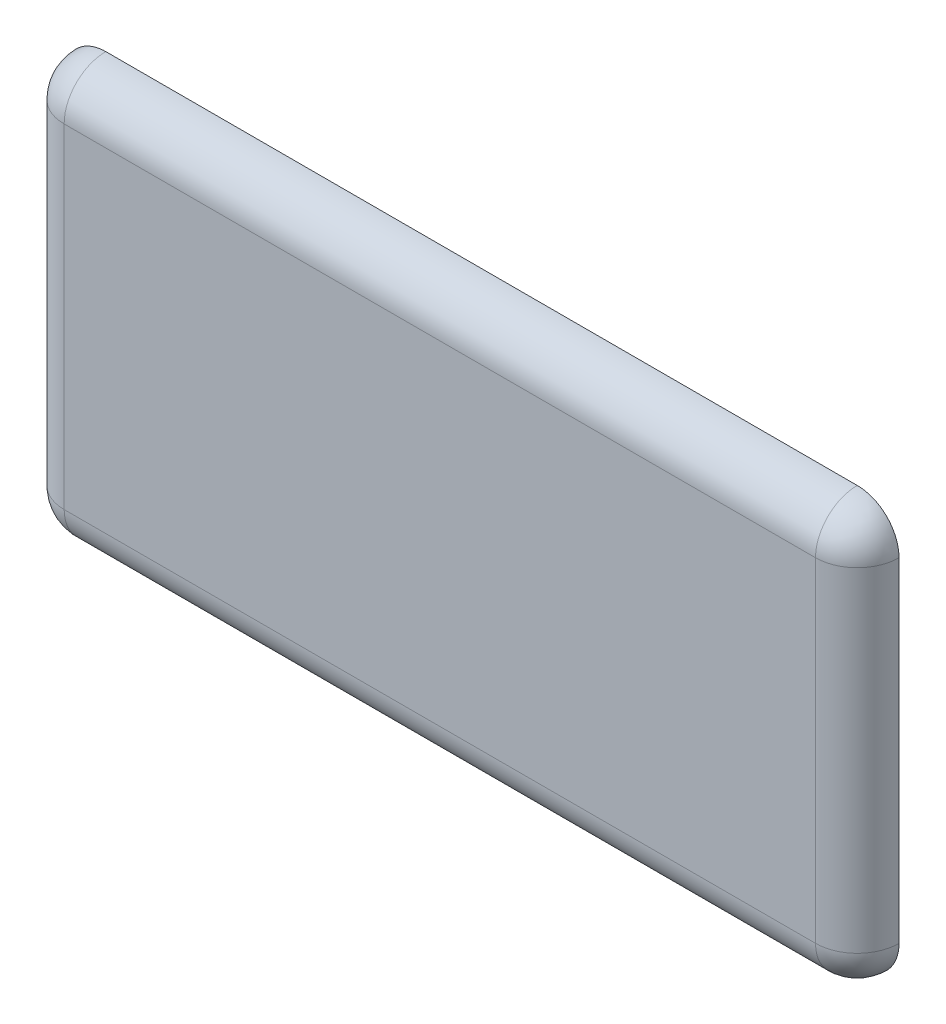
ISO-10303-21;
HEADER;
FILE_DESCRIPTION(('STEP AP214'),'2;1');
FILE_NAME('part.step','',(''),(''),'','','');
FILE_SCHEMA(('AUTOMOTIVE_DESIGN { 1 0 10303 214 1 1 1 1 }'));
ENDSEC;
DATA;
#1=APPLICATION_CONTEXT('core data for automotive mechanical design processes');
#2=APPLICATION_PROTOCOL_DEFINITION('international standard','automotive_design',2000,#1);
#3=PRODUCT_CONTEXT('',#1,'mechanical');
#4=PRODUCT('Part','Part','',(#3));
#5=PRODUCT_RELATED_PRODUCT_CATEGORY('part','',(#4));
#6=PRODUCT_DEFINITION_FORMATION('','',#4);
#7=PRODUCT_DEFINITION_CONTEXT('part definition',#1,'design');
#8=PRODUCT_DEFINITION('design','',#6,#7);
#9=PRODUCT_DEFINITION_SHAPE('','',#8);
#10=(LENGTH_UNIT() NAMED_UNIT(*) SI_UNIT(.MILLI.,.METRE.));
#11=(NAMED_UNIT(*) PLANE_ANGLE_UNIT() SI_UNIT($,.RADIAN.));
#12=(NAMED_UNIT(*) SI_UNIT($,.STERADIAN.) SOLID_ANGLE_UNIT());
#13=UNCERTAINTY_MEASURE_WITH_UNIT(LENGTH_MEASURE(1.E-05),#10,'distance_accuracy_value','');
#14=(GEOMETRIC_REPRESENTATION_CONTEXT(3) GLOBAL_UNCERTAINTY_ASSIGNED_CONTEXT((#13)) GLOBAL_UNIT_ASSIGNED_CONTEXT((#10,
#11,#12)) REPRESENTATION_CONTEXT('',''));
#15=CARTESIAN_POINT('',(0.,0.,0.));
#16=DIRECTION('',(0.,0.,1.));
#17=DIRECTION('',(1.,0.,0.));
#18=AXIS2_PLACEMENT_3D('',#15,#16,#17);
#19=CARTESIAN_POINT('',(4.,4.,4.));
#20=DIRECTION('',(0.,0.,1.));
#21=DIRECTION('',(1.,0.,0.));
#22=AXIS2_PLACEMENT_3D('',#19,#20,#21);
#23=PLANE('',#22);
#24=DIRECTION('',(-1.,0.,0.));
#25=VECTOR('',#24,1.);
#26=CARTESIAN_POINT('',(76.,4.00000000000005,3.99999999999999));
#27=LINE('',#26,#25);
#28=CARTESIAN_POINT('',(75.9999999996317,4.00000000000002,3.99999999999944));
#29=VERTEX_POINT('',#28);
#30=CARTESIAN_POINT('',(3.99999999999997,4.00000000000002,4.00000000000005));
#31=VERTEX_POINT('',#30);
#32=EDGE_CURVE('E90',#29,#31,#27,.T.);
#33=ORIENTED_EDGE('',*,*,#32,.F.);
#34=DIRECTION('',(0.,-1.,0.));
#35=VECTOR('',#34,1.);
#36=CARTESIAN_POINT('',(76.,36.,3.9999999999989));
#37=LINE('',#36,#35);
#38=CARTESIAN_POINT('',(76.,35.9999946296296,3.9999999999997));
#39=VERTEX_POINT('',#38);
#40=EDGE_CURVE('E67',#39,#29,#37,.T.);
#41=ORIENTED_EDGE('',*,*,#40,.F.);
#42=DIRECTION('',(1.,0.,0.));
#43=VECTOR('',#42,1.);
#44=CARTESIAN_POINT('',(4.,35.9999983333333,4.));
#45=LINE('',#44,#43);
#46=CARTESIAN_POINT('',(3.99999698393829,35.9999939253962,3.99999999999943));
#47=VERTEX_POINT('',#46);
#48=EDGE_CURVE('E112',#47,#39,#45,.T.);
#49=ORIENTED_EDGE('',*,*,#48,.F.);
#50=DIRECTION('',(0.,-1.,0.));
#51=VECTOR('',#50,1.);
#52=CARTESIAN_POINT('',(4.,36.,4.00000000000012));
#53=LINE('',#52,#51);
#54=EDGE_CURVE('E91',#31,#47,#53,.F.);
#55=ORIENTED_EDGE('',*,*,#54,.F.);
#56=EDGE_LOOP('',(#33,#41,#49,#55));
#57=FACE_BOUND('',#56,.T.);
#58=ADVANCED_FACE('F16',(#57),#23,.T.);
#59=CARTESIAN_POINT('',(76.,36.,0.));
#60=DIRECTION('',(0.381049633011538,-0.924554583127342,0.));
#61=DIRECTION('',(0.,0.,-1.));
#62=AXIS2_PLACEMENT_3D('',#59,#60,#61);
#63=SPHERICAL_SURFACE('',#62,3.99999999999981);
#64=CARTESIAN_POINT('',(76.,39.9999999999998,0.));
#65=CARTESIAN_POINT('',(76.1125064846693,40.0000107801648,0.));
#66=CARTESIAN_POINT('',(76.2250078596815,39.9952533978363,0.));
#67=CARTESIAN_POINT('',(76.4492056808409,39.9762857323358,0.));
#68=CARTESIAN_POINT('',(76.5609021653406,39.9620759026152,0.));
#69=CARTESIAN_POINT('',(76.7826226412643,39.9243010286425,0.));
#70=CARTESIAN_POINT('',(76.8926478326796,39.900743061469,0.));
#71=CARTESIAN_POINT('',(77.1102957536248,39.8444630035519,0.));
#72=CARTESIAN_POINT('',(77.2179185124643,39.8117410246754,0.));
#73=CARTESIAN_POINT('',(77.5361447238502,39.7000934071667,0.));
#74=CARTESIAN_POINT('',(77.7421963398768,39.6076706332295,0.));
#75=CARTESIAN_POINT('',(78.1357069471823,39.3896049845834,0.));
#76=CARTESIAN_POINT('',(78.3231692057971,39.2639679620186,0.));
#77=CARTESIAN_POINT('',(78.6743715803179,38.9829981889779,0.));
#78=CARTESIAN_POINT('',(78.8381119277055,38.8276657283084,0.));
#79=CARTESIAN_POINT('',(79.1372150568841,38.4916826745306,0.));
#80=CARTESIAN_POINT('',(79.2725722809909,38.3110271344568,0.));
#81=CARTESIAN_POINT('',(79.5110563074748,37.9295368825367,0.));
#82=CARTESIAN_POINT('',(79.6141767999037,37.7286982302454,0.));
#83=CARTESIAN_POINT('',(79.7851821448691,37.3125987428058,0.));
#84=CARTESIAN_POINT('',(79.85308763485,37.0973464383637,0.));
#85=CARTESIAN_POINT('',(79.9348605214169,36.7339807389415,0.));
#86=CARTESIAN_POINT('',(79.9592730691926,36.5881531888869,0.));
#87=CARTESIAN_POINT('',(79.9918406722692,36.2949041344534,0.));
#88=CARTESIAN_POINT('',(80.0000187754479,36.1474851889585,0.));
#89=CARTESIAN_POINT('',(79.9999999999998,36.0000000000001,0.));
#90=B_SPLINE_CURVE_WITH_KNOTS('',3,(#64,#65,#66,#67,#68,#69,#70,#71,#72,#73,#74,#75,#76,#77,#78,
#79,#80,#81,#82,#83,#84,#85,#86,#87,#88,#89),.UNSPECIFIED.,.F.,.F.,(4,2,2,2,2,2,2,2,2,2,2,2,4),
(0.,0.337409690213672,0.674803195430451,1.01194176015814,1.34907620955056,2.02307394016258,
2.69695299561827,3.37082547482495,4.04482978167726,4.71896593418993,5.39270656736755,
5.83543557899228,6.27753560189477),.UNSPECIFIED.);
#91=CARTESIAN_POINT('',(76.,39.9999947435897,0.));
#92=VERTEX_POINT('',#91);
#93=CARTESIAN_POINT('',(79.9999999999998,36.,0.));
#94=VERTEX_POINT('',#93);
#95=EDGE_CURVE('E114',#92,#94,#90,.T.);
#96=ORIENTED_EDGE('',*,*,#95,.F.);
#97=CARTESIAN_POINT('',(76.,39.9999999999998,0.));
#98=CARTESIAN_POINT('',(75.9998688575037,40.0000019971717,0.0741499115106724));
#99=CARTESIAN_POINT('',(75.9996634653779,39.9979381764212,0.148297534387984));
#100=CARTESIAN_POINT('',(75.9993613868545,39.9897283979854,0.295754471272515));
#101=CARTESIAN_POINT('',(75.999263819873,39.9836161701213,0.369065662880881));
#102=CARTESIAN_POINT('',(75.9994259186952,39.967171062917,0.516927306231345));
#103=CARTESIAN_POINT('',(75.9996938654879,39.9567442001472,0.591467402450888));
#104=CARTESIAN_POINT('',(75.9999296973082,39.9377551802842,0.703986049897767));
#105=CARTESIAN_POINT('',(75.9999800093613,39.9307260849792,0.742229077633415));
#106=CARTESIAN_POINT('',(76.0000180127654,39.9163065782062,0.814720880165904));
#107=CARTESIAN_POINT('',(76.000011407297,39.9090207240107,0.848990480687181));
#108=CARTESIAN_POINT('',(76.0000189047354,39.8853680474026,0.953473393795146));
#109=CARTESIAN_POINT('',(76.000062303017,39.8675476206773,1.02336344051551));
#110=CARTESIAN_POINT('',(76.0001028626452,39.8272511846961,1.16526224007295));
#111=CARTESIAN_POINT('',(76.0000978075774,39.8045988657442,1.2372207646452));
#112=CARTESIAN_POINT('',(76.0000448147382,39.7540029992485,1.38338079503893));
#113=CARTESIAN_POINT('',(75.9999947026984,39.7258484896681,1.45750948079101));
#114=CARTESIAN_POINT('',(76.0000046392359,39.6689556082914,1.59486157767355));
#115=CARTESIAN_POINT('',(76.0000517762743,39.6407242551955,1.6582957416157));
#116=CARTESIAN_POINT('',(76.0001198970873,39.5791706206728,1.78744597647618));
#117=CARTESIAN_POINT('',(76.0001391032633,39.5456424892112,1.85306403055476));
#118=CARTESIAN_POINT('',(76.0001149896674,39.4729108847655,1.98619729913405));
#119=CARTESIAN_POINT('',(76.000067883723,39.433488481998,2.05359328330954));
#120=CARTESIAN_POINT('',(76.0000155164451,39.3705707533344,2.15427691549354));
#121=CARTESIAN_POINT('',(76.0000010182472,39.348482575026,2.1884514615617));
#122=CARTESIAN_POINT('',(75.999999144699,39.3068915739986,2.25069680360541));
#123=CARTESIAN_POINT('',(76.0000078002596,39.2875406688681,2.27886920496695));
#124=CARTESIAN_POINT('',(76.0000382400029,39.2265658435533,2.36524668660633));
#125=CARTESIAN_POINT('',(76.0000640297798,39.1837276153916,2.42260157085266));
#126=CARTESIAN_POINT('',(76.0000856046525,39.0923680353896,2.53830984032111));
#127=CARTESIAN_POINT('',(76.000079489659,39.0436598014988,2.59651541749076));
#128=CARTESIAN_POINT('',(76.0000253786652,38.9401373064271,2.71330480137671));
#129=CARTESIAN_POINT('',(75.9999750132988,38.8851332277695,2.77172075075565));
#130=CARTESIAN_POINT('',(76.0000194453907,38.7842967565098,2.87255770385692));
#131=CARTESIAN_POINT('',(76.0000845271071,38.7391355719894,2.91565289347235));
#132=CARTESIAN_POINT('',(76.000270753264,38.6438076798383,3.00244972417924));
#133=CARTESIAN_POINT('',(76.0003953050452,38.5935071442835,3.04600466246026));
#134=CARTESIAN_POINT('',(76.0006047991161,38.4876078713509,3.13317702504959));
#135=CARTESIAN_POINT('',(76.000686801067,38.431874099724,3.17663033815556));
#136=CARTESIAN_POINT('',(76.0007768580484,38.3148440276089,3.26298781242491));
#137=CARTESIAN_POINT('',(76.0007802932854,38.2534132076597,3.30571024450839));
#138=CARTESIAN_POINT('',(76.0007265322809,38.1582492513185,3.36800797658096));
#139=CARTESIAN_POINT('',(76.0006975988659,38.1253483103497,3.38886582846301));
#140=CARTESIAN_POINT('',(76.0006233074073,38.058066619047,3.43015454424354));
#141=CARTESIAN_POINT('',(76.0005775327432,38.0236697887704,3.45055927167883));
#142=CARTESIAN_POINT('',(76.0004753544321,37.9533814500471,3.49084284982618));
#143=CARTESIAN_POINT('',(76.0004187062305,37.9174743021363,3.51069439835718));
#144=CARTESIAN_POINT('',(76.0003040477201,37.8441537544346,3.54976981512328));
#145=CARTESIAN_POINT('',(76.0002460390644,37.8067252004519,3.56896525456613));
#146=CARTESIAN_POINT('',(76.000139387507,37.730355627816,3.60662253510487));
#147=CARTESIAN_POINT('',(76.0000910092735,37.6914000305115,3.62505482781924));
#148=CARTESIAN_POINT('',(76.0000229758318,37.6119771490597,3.66107585072054));
#149=CARTESIAN_POINT('',(76.0000040341763,37.5714959810948,3.67863392226024));
#150=CARTESIAN_POINT('',(75.9999938022788,37.4681105193974,3.72145740593015));
#151=CARTESIAN_POINT('',(76.0000227896367,37.404823887234,3.74580620838688));
#152=CARTESIAN_POINT('',(76.000059954284,37.2718119897775,3.79313615442436));
#153=CARTESIAN_POINT('',(76.0000662110757,37.201987282329,3.815837400216));
#154=CARTESIAN_POINT('',(76.0000560938495,37.0558049142171,3.85895286987174));
#155=CARTESIAN_POINT('',(76.0000379527386,36.9793559770724,3.87905947370731));
#156=CARTESIAN_POINT('',(76.0000045727445,36.8618500573143,3.9062701600055));
#157=CARTESIAN_POINT('',(75.9999920244167,36.8211684835732,3.91502405491543));
#158=CARTESIAN_POINT('',(76.0000050866501,36.754335035777,3.928318071978));
#159=CARTESIAN_POINT('',(76.0000185216174,36.728257804406,3.93323596210387));
#160=CARTESIAN_POINT('',(76.0000757919011,36.6391980356264,3.94911530927755));
#161=CARTESIAN_POINT('',(76.0001357891875,36.5759862436643,3.9588288245884));
#162=CARTESIAN_POINT('',(76.0001739798897,36.4754923657935,3.97181399352602));
#163=CARTESIAN_POINT('',(76.0001757876713,36.4383351014697,3.97608617070908));
#164=CARTESIAN_POINT('',(76.0001627156972,36.360308503568,3.98395034698343));
#165=CARTESIAN_POINT('',(76.0001462020771,36.3194283356242,3.98743633444423));
#166=CARTESIAN_POINT('',(76.0001012067765,36.2339667067364,3.99340115138218));
#167=CARTESIAN_POINT('',(76.0000717970993,36.1893771487984,3.99576387402017));
#168=CARTESIAN_POINT('',(76.0000210916473,36.0965277242967,3.99912646840141));
#169=CARTESIAN_POINT('',(76.0000006466102,36.0482632679732,4.00000037219625));
#170=CARTESIAN_POINT('',(76.,35.9999983333333,3.99999999999947));
#171=B_SPLINE_CURVE_WITH_KNOTS('',3,(#97,#98,#99,#100,#101,#102,#103,#104,#105,#106,#107,#108,
#109,#110,#111,#112,#113,#114,#115,#116,#117,#118,#119,#120,#121,#122,#123,#124,#125,#126,#127,
#128,#129,#130,#131,#132,#133,#134,#135,#136,#137,#138,#139,#140,#141,#142,#143,#144,#145,#146,
#147,#148,#149,#150,#151,#152,#153,#154,#155,#156,#157,#158,#159,#160,#161,#162,#163,#164,#165,
#166,#167,#168,#169,#170),.UNSPECIFIED.,.F.,.F.,(4,2,2,2,2,2,2,2,2,2,2,2,2,2,2,2,2,2,2,2,2,2,2,
2,2,2,2,2,2,2,2,2,2,2,2,2,4),(0.,0.222417107584018,0.443004044117348,0.668672421350455,
0.785308823638937,0.890405222374476,1.10666933983117,1.33287163712201,1.57061238118346,
1.77881939766156,1.99977174746332,2.23386354765696,2.35592082185084,2.45844574374509,
2.6730946516346,2.9006676552998,3.14122346247322,3.32843111360665,3.52795779182127,
3.73987604262706,3.96422516162846,4.08107766836807,4.20104000291186,4.32410892828857,
4.45027954744465,4.57954535156464,4.71189826888602,4.91523258461934,5.13539259159881,
5.37238755666628,5.49720720552452,5.57681440863209,5.76858748558689,5.88078197234026,
6.0038472341257,6.13777877391592,6.28256453799615),.UNSPECIFIED.);
#172=EDGE_CURVE('E109',#39,#92,#171,.F.);
#173=ORIENTED_EDGE('',*,*,#172,.F.);
#174=CARTESIAN_POINT('',(76.0000000000002,36.,-5.42751607546244E-13));
#175=DIRECTION('',(0.,-1.,0.));
#176=DIRECTION('',(0.,0.,-1.));
#177=AXIS2_PLACEMENT_3D('',#174,#175,#176);
#178=CIRCLE('',#177,3.99999999999944);
#179=EDGE_CURVE('E74',#94,#39,#178,.T.);
#180=ORIENTED_EDGE('',*,*,#179,.F.);
#181=EDGE_LOOP('',(#96,#173,#180));
#182=FACE_BOUND('',#181,.T.);
#183=ADVANCED_FACE('F125',(#182),#63,.T.);
#184=CARTESIAN_POINT('',(76.0000000000002,36.,-5.42751607546244E-13));
#185=DIRECTION('',(0.,-1.,0.));
#186=DIRECTION('',(0.,0.,-1.));
#187=AXIS2_PLACEMENT_3D('',#184,#185,#186);
#188=CYLINDRICAL_SURFACE('',#187,3.99999999999944);
#189=CARTESIAN_POINT('',(76.0000000000002,4.,-5.42751607546244E-13));
#190=DIRECTION('',(0.,-1.,0.));
#191=DIRECTION('',(0.,0.,-1.));
#192=AXIS2_PLACEMENT_3D('',#189,#190,#191);
#193=CIRCLE('',#192,3.99999999999944);
#194=CARTESIAN_POINT('',(79.9999999999998,4.,0.));
#195=VERTEX_POINT('',#194);
#196=EDGE_CURVE('E71',#195,#29,#193,.T.);
#197=ORIENTED_EDGE('',*,*,#196,.F.);
#198=DIRECTION('',(0.,1.,0.));
#199=VECTOR('',#198,1.);
#200=CARTESIAN_POINT('',(79.9999999999999,0.,0.));
#201=LINE('',#200,#199);
#202=EDGE_CURVE('E212',#94,#195,#201,.F.);
#203=ORIENTED_EDGE('',*,*,#202,.F.);
#204=ORIENTED_EDGE('',*,*,#179,.T.);
#205=ORIENTED_EDGE('',*,*,#40,.T.);
#206=EDGE_LOOP('',(#197,#203,#204,#205));
#207=FACE_BOUND('',#206,.T.);
#208=ADVANCED_FACE('F69',(#207),#188,.T.);
#209=CARTESIAN_POINT('',(76.,4.,0.));
#210=DIRECTION('',(-0.924554583722732,-0.381049631566919,0.));
#211=DIRECTION('',(0.,0.,-1.));
#212=AXIS2_PLACEMENT_3D('',#209,#210,#211);
#213=SPHERICAL_SURFACE('',#212,4.00000000000002);
#214=CARTESIAN_POINT('',(80.,4.,0.));
#215=CARTESIAN_POINT('',(80.000010780165,3.88749351533068,0.));
#216=CARTESIAN_POINT('',(79.9952533978365,3.77499214031856,0.));
#217=CARTESIAN_POINT('',(79.9762857323361,3.55079431915904,0.));
#218=CARTESIAN_POINT('',(79.9620759026154,3.43909783465938,0.));
#219=CARTESIAN_POINT('',(79.9243010286427,3.21737735873566,0.));
#220=CARTESIAN_POINT('',(79.9007430614691,3.10735216732032,0.));
#221=CARTESIAN_POINT('',(79.8444630035521,2.88970424637512,0.));
#222=CARTESIAN_POINT('',(79.8117410246755,2.78208148753563,0.));
#223=CARTESIAN_POINT('',(79.7000934071669,2.46385527614969,0.));
#224=CARTESIAN_POINT('',(79.6076706332297,2.2578036601231,0.));
#225=CARTESIAN_POINT('',(79.3896049845835,1.86429305281761,0.));
#226=CARTESIAN_POINT('',(79.2639679620188,1.67683079420276,0.));
#227=CARTESIAN_POINT('',(78.982998188978,1.32562841968195,0.));
#228=CARTESIAN_POINT('',(78.8276657283085,1.16188807229426,0.));
#229=CARTESIAN_POINT('',(78.4916826745307,0.862784943115712,0.));
#230=CARTESIAN_POINT('',(78.3110271344569,0.727427719008955,0.));
#231=CARTESIAN_POINT('',(77.9295368825369,0.48894369252512,0.));
#232=CARTESIAN_POINT('',(77.7286982302457,0.385823200096195,0.));
#233=CARTESIAN_POINT('',(77.3125987428062,0.214817855130758,0.));
#234=CARTESIAN_POINT('',(77.0973464383641,0.146912365149834,0.));
#235=CARTESIAN_POINT('',(76.7339807388217,0.065139478555993,0.));
#236=CARTESIAN_POINT('',(76.5881531886444,0.0407269307666435,0.));
#237=CARTESIAN_POINT('',(76.2949041339638,0.00815932768983181,0.));
#238=CARTESIAN_POINT('',(76.1474851883445,-1.87754753872442E-05,0.));
#239=CARTESIAN_POINT('',(75.9999999992633,0.,0.));
#240=B_SPLINE_CURVE_WITH_KNOTS('',3,(#214,#215,#216,#217,#218,#219,#220,#221,#222,#223,#224,
#225,#226,#227,#228,#229,#230,#231,#232,#233,#234,#235,#236,#237,#238,#239),.UNSPECIFIED.,.F.,
.F.,(4,2,2,2,2,2,2,2,2,2,2,2,4),(0.,0.337409690213704,0.67480319543053,1.01194176015822,
1.34907620955065,2.02307394016268,2.69695299561844,3.37082547482527,4.0448297816775,
4.71896593418976,5.39270656736788,5.83543557936029,6.27753560263078),.UNSPECIFIED.);
#241=CARTESIAN_POINT('',(75.9999999992632,0.,0.));
#242=VERTEX_POINT('',#241);
#243=EDGE_CURVE('E86',#195,#242,#240,.T.);
#244=ORIENTED_EDGE('',*,*,#243,.F.);
#245=ORIENTED_EDGE('',*,*,#196,.T.);
#246=CARTESIAN_POINT('',(75.9999999992632,4.00000000000005,0.));
#247=DIRECTION('',(-1.,0.,0.));
#248=DIRECTION('',(0.,0.,1.));
#249=AXIS2_PLACEMENT_3D('',#246,#247,#248);
#250=CIRCLE('',#249,4.);
#251=EDGE_CURVE('E83',#242,#29,#250,.T.);
#252=ORIENTED_EDGE('',*,*,#251,.F.);
#253=EDGE_LOOP('',(#244,#245,#252));
#254=FACE_BOUND('',#253,.T.);
#255=ADVANCED_FACE('F81',(#254),#213,.T.);
#256=CARTESIAN_POINT('',(76.,4.00000000000005,0.));
#257=DIRECTION('',(-1.,0.,0.));
#258=DIRECTION('',(0.,0.,1.));
#259=AXIS2_PLACEMENT_3D('',#256,#257,#258);
#260=CYLINDRICAL_SURFACE('',#259,4.);
#261=ORIENTED_EDGE('',*,*,#251,.T.);
#262=ORIENTED_EDGE('',*,*,#32,.T.);
#263=CARTESIAN_POINT('',(4.,4.00000000000005,0.));
#264=DIRECTION('',(-1.,0.,0.));
#265=DIRECTION('',(0.,0.,1.));
#266=AXIS2_PLACEMENT_3D('',#263,#264,#265);
#267=CIRCLE('',#266,4.);
#268=CARTESIAN_POINT('',(4.,0.,0.));
#269=VERTEX_POINT('',#268);
#270=EDGE_CURVE('E95',#269,#31,#267,.T.);
#271=ORIENTED_EDGE('',*,*,#270,.F.);
#272=DIRECTION('',(-1.,0.,0.));
#273=VECTOR('',#272,1.);
#274=CARTESIAN_POINT('',(80.,0.,0.));
#275=LINE('',#274,#273);
#276=EDGE_CURVE('E99',#242,#269,#275,.T.);
#277=ORIENTED_EDGE('',*,*,#276,.F.);
#278=EDGE_LOOP('',(#261,#262,#271,#277));
#279=FACE_BOUND('',#278,.T.);
#280=ADVANCED_FACE('F97',(#279),#260,.T.);
#281=CARTESIAN_POINT('',(4.,4.,0.));
#282=DIRECTION('',(-0.381049631566923,0.924554583722731,0.));
#283=DIRECTION('',(0.,0.,-1.));
#284=AXIS2_PLACEMENT_3D('',#281,#282,#283);
#285=SPHERICAL_SURFACE('',#284,4.00000000000001);
#286=CARTESIAN_POINT('',(4.,0.,0.));
#287=CARTESIAN_POINT('',(3.88749351533069,-1.0780165015545E-05,0.));
#288=CARTESIAN_POINT('',(3.77499214031857,0.00474660216351305,0.));
#289=CARTESIAN_POINT('',(3.55079431915907,0.0237142676639679,0.));
#290=CARTESIAN_POINT('',(3.43909783465941,0.0379240973845898,0.));
#291=CARTESIAN_POINT('',(3.21737735873569,0.0756989713572762,0.));
#292=CARTESIAN_POINT('',(3.10735216732035,0.099256938530861,0.));
#293=CARTESIAN_POINT('',(2.88970424637514,0.155536996447868,0.));
#294=CARTESIAN_POINT('',(2.78208148753564,0.188258975324454,0.));
#295=CARTESIAN_POINT('',(2.4638552761497,0.299906592833117,0.));
#296=CARTESIAN_POINT('',(2.25780366012309,0.39232936677034,0.));
#297=CARTESIAN_POINT('',(1.8642930528176,0.610395015416483,0.));
#298=CARTESIAN_POINT('',(1.67683079420276,0.736032037981202,0.));
#299=CARTESIAN_POINT('',(1.32562841968199,1.01700181102196,0.));
#300=CARTESIAN_POINT('',(1.16188807229434,1.17233427169145,0.));
#301=CARTESIAN_POINT('',(0.862784943115782,1.50831732546924,0.));
#302=CARTESIAN_POINT('',(0.72742771900899,1.68897286554305,0.));
#303=CARTESIAN_POINT('',(0.488943692525055,2.07046311746318,0.));
#304=CARTESIAN_POINT('',(0.385823200096081,2.27130176975454,0.));
#305=CARTESIAN_POINT('',(0.214817855130689,2.68740125719416,0.));
#306=CARTESIAN_POINT('',(0.146912365149813,2.90265356163622,0.));
#307=CARTESIAN_POINT('',(0.0651394785829451,3.26601926105849,0.));
#308=CARTESIAN_POINT('',(0.0407269308072264,3.41184681111312,0.));
#309=CARTESIAN_POINT('',(0.00815932773058092,3.70509586554663,0.));
#310=CARTESIAN_POINT('',(-1.8775448095764E-05,3.85251481104155,0.));
#311=CARTESIAN_POINT('',(0.,3.99999999999994,0.));
#312=B_SPLINE_CURVE_WITH_KNOTS('',3,(#286,#287,#288,#289,#290,#291,#292,#293,#294,#295,#296,
#297,#298,#299,#300,#301,#302,#303,#304,#305,#306,#307,#308,#309,#310,#311),.UNSPECIFIED.,.F.,
.F.,(4,2,2,2,2,2,2,2,2,2,2,2,4),(0.,0.337409690213687,0.674803195430497,1.0119417601582,
1.34907620955064,2.02307394016271,2.69695299561843,3.37082547482513,4.04482978167748,
4.71896593419017,5.39270656736783,5.8354355789926,6.27753560189512),.UNSPECIFIED.);
#313=CARTESIAN_POINT('',(0.,4.,0.));
#314=VERTEX_POINT('',#313);
#315=EDGE_CURVE('E197',#269,#314,#312,.T.);
#316=ORIENTED_EDGE('',*,*,#315,.F.);
#317=ORIENTED_EDGE('',*,*,#270,.T.);
#318=CARTESIAN_POINT('',(3.99999999999993,4.,0.));
#319=DIRECTION('',(0.,-1.,0.));
#320=DIRECTION('',(0.,0.,-1.));
#321=AXIS2_PLACEMENT_3D('',#318,#319,#320);
#322=CIRCLE('',#321,4.00000000000005);
#323=EDGE_CURVE('E103',#314,#31,#322,.F.);
#324=ORIENTED_EDGE('',*,*,#323,.F.);
#325=EDGE_LOOP('',(#316,#317,#324));
#326=FACE_BOUND('',#325,.T.);
#327=ADVANCED_FACE('F190',(#326),#285,.T.);
#328=CARTESIAN_POINT('',(3.99999999999993,36.,0.));
#329=DIRECTION('',(0.,-1.,0.));
#330=DIRECTION('',(0.,0.,-1.));
#331=AXIS2_PLACEMENT_3D('',#328,#329,#330);
#332=CYLINDRICAL_SURFACE('',#331,4.00000000000005);
#333=CARTESIAN_POINT('',(3.99999999999993,35.9999958196107,0.));
#334=DIRECTION('',(0.,-1.,0.));
#335=DIRECTION('',(0.,0.,-1.));
#336=AXIS2_PLACEMENT_3D('',#333,#334,#335);
#337=CIRCLE('',#336,4.00000000000005);
#338=CARTESIAN_POINT('',(0.,35.9999974917664,0.));
#339=VERTEX_POINT('',#338);
#340=EDGE_CURVE('E107',#339,#47,#337,.F.);
#341=ORIENTED_EDGE('',*,*,#340,.F.);
#342=DIRECTION('',(0.,1.,0.));
#343=VECTOR('',#342,1.);
#344=CARTESIAN_POINT('',(0.,0.,0.));
#345=LINE('',#344,#343);
#346=EDGE_CURVE('E203',#314,#339,#345,.T.);
#347=ORIENTED_EDGE('',*,*,#346,.F.);
#348=ORIENTED_EDGE('',*,*,#323,.T.);
#349=ORIENTED_EDGE('',*,*,#54,.T.);
#350=EDGE_LOOP('',(#341,#347,#348,#349));
#351=FACE_BOUND('',#350,.T.);
#352=ADVANCED_FACE('F194',(#351),#332,.T.);
#353=CARTESIAN_POINT('',(4.,36.,0.));
#354=DIRECTION('',(0.923908140645023,0.382614358917508,0.));
#355=DIRECTION('',(0.,0.,-1.));
#356=AXIS2_PLACEMENT_3D('',#353,#354,#355);
#357=SPHERICAL_SURFACE('',#356,3.99999999999997);
#358=ORIENTED_EDGE('',*,*,#340,.T.);
#359=CARTESIAN_POINT('',(3.99999581949663,35.9999958196107,3.9999999999956));
#360=CARTESIAN_POINT('',(3.99980230712181,36.0117413888183,4.00000001072928));
#361=CARTESIAN_POINT('',(3.99963818135978,36.0234873208929,3.99994827455735));
#362=CARTESIAN_POINT('',(3.99907175719415,36.0701952209732,3.99953677614364));
#363=CARTESIAN_POINT('',(3.99883990466916,36.105155989981,3.99877030331508));
#364=CARTESIAN_POINT('',(3.99819310119417,36.1982410903931,3.99550762765604));
#365=CARTESIAN_POINT('',(3.99775875798833,36.2563390022284,3.99220103443553));
#366=CARTESIAN_POINT('',(3.99716232414924,36.3519998443581,3.98466009379023));
#367=CARTESIAN_POINT('',(3.99695816910623,36.3896223503731,3.98115723522356));
#368=CARTESIAN_POINT('',(3.99658128558697,36.4705058803972,3.9724690494497));
#369=CARTESIAN_POINT('',(3.99641815324059,36.5137483417134,3.96710824577669));
#370=CARTESIAN_POINT('',(3.99613304955829,36.5981462767459,3.95524232072183));
#371=CARTESIAN_POINT('',(3.99600958928897,36.6393102631085,3.94879754724046));
#372=CARTESIAN_POINT('',(3.99574162473867,36.7205047282664,3.9347826041569));
#373=CARTESIAN_POINT('',(3.99559764888204,36.7605400731642,3.92724061593715));
#374=CARTESIAN_POINT('',(3.9953155356324,36.8394527851833,3.91112280686673));
#375=CARTESIAN_POINT('',(3.99517733995184,36.8783357560233,3.90257444951882));
#376=CARTESIAN_POINT('',(3.99490927528919,36.9549229917351,3.88453444530613));
#377=CARTESIAN_POINT('',(3.99477928721538,36.992633575875,3.87506949268782));
#378=CARTESIAN_POINT('',(3.99441616005415,37.1026273887306,3.84575073876997));
#379=CARTESIAN_POINT('',(3.9941992340722,37.1745199220657,3.82440681884511));
#380=CARTESIAN_POINT('',(3.99384841905154,37.3134456402797,3.77887525426246));
#381=CARTESIAN_POINT('',(3.99371093832792,37.380542732334,3.7548817106149));
#382=CARTESIAN_POINT('',(3.993517839945,37.5098900402318,3.70469261864669));
#383=CARTESIAN_POINT('',(3.99345831970552,37.5722103079437,3.67867766843878));
#384=CARTESIAN_POINT('',(3.99339803027878,37.6920647376664,3.62504394696798));
#385=CARTESIAN_POINT('',(3.99339421025473,37.7496736334176,3.5975920449606));
#386=CARTESIAN_POINT('',(3.9934096513311,37.8602133446382,3.54163449104222));
#387=CARTESIAN_POINT('',(3.99342758767712,37.913221789728,3.51328209890476));
#388=CARTESIAN_POINT('',(3.9934222684274,38.0147043572553,3.45602466591289));
#389=CARTESIAN_POINT('',(3.99340146606549,38.06325746701,3.42725958431065));
#390=CARTESIAN_POINT('',(3.99329816878745,38.1529275213801,3.37153884270188));
#391=CARTESIAN_POINT('',(3.99322396777623,38.1941965629852,3.34482756007317));
#392=CARTESIAN_POINT('',(3.99306873472787,38.2752573275049,3.29021534456955));
#393=CARTESIAN_POINT('',(3.99298779027773,38.3150605329396,3.26233145991076));
#394=CARTESIAN_POINT('',(3.99281859855483,38.393173217166,3.20546057498874));
#395=CARTESIAN_POINT('',(3.99273044584674,38.4314946020903,3.17648992484576));
#396=CARTESIAN_POINT('',(3.9925564024362,38.5066326132887,3.11752973160535));
#397=CARTESIAN_POINT('',(3.99247049736732,38.5434615075246,3.08755582193573));
#398=CARTESIAN_POINT('',(3.99230577350136,38.6156079732313,3.02667108209286));
#399=CARTESIAN_POINT('',(3.99222688406753,38.6509381197542,2.99577515200565));
#400=CARTESIAN_POINT('',(3.99208028752045,38.7200848196367,2.93312581003021));
#401=CARTESIAN_POINT('',(3.99201246099955,38.7539141994801,2.90138655419497));
#402=CARTESIAN_POINT('',(3.99189042401301,38.8200610222058,2.8371273129054));
#403=CARTESIAN_POINT('',(3.99183606410522,38.85239148899,2.80462073329607));
#404=CARTESIAN_POINT('',(3.99174210094985,38.9155457549682,2.73890076106974));
#405=CARTESIAN_POINT('',(3.99170233309397,38.9463827228358,2.70570002241294));
#406=CARTESIAN_POINT('',(3.99163742813004,39.0065585511424,2.63866269948665));
#407=CARTESIAN_POINT('',(3.99161212606065,39.035910674171,2.60483801970489));
#408=CARTESIAN_POINT('',(3.99157487374079,39.0931283510095,2.5366207442401));
#409=CARTESIAN_POINT('',(3.99156277180701,39.1210072124479,2.50223930975953));
#410=CARTESIAN_POINT('',(3.99154958545476,39.1752925762366,2.43297335443729));
#411=CARTESIAN_POINT('',(3.99154837514761,39.2017123845569,2.39809926113176));
#412=CARTESIAN_POINT('',(3.99155364976408,39.253096227114,2.32790967864292));
#413=CARTESIAN_POINT('',(3.99156004623897,39.2780735212967,2.29260389604804));
#414=CARTESIAN_POINT('',(3.99157641388645,39.3265910082671,2.22160947038018));
#415=CARTESIAN_POINT('',(3.99158634332548,39.3501443730651,2.18592982842953));
#416=CARTESIAN_POINT('',(3.99160458141925,39.3958344854857,2.1142430669725));
#417=CARTESIAN_POINT('',(3.99161290719123,39.4179842778133,2.07824426106831));
#418=CARTESIAN_POINT('',(3.99162308942742,39.4608892762496,2.00597143122675));
#419=CARTESIAN_POINT('',(3.99162501758168,39.4816573629948,1.96970505338701));
#420=CARTESIAN_POINT('',(3.99161307677361,39.5218222769741,1.89694623513234));
#421=CARTESIAN_POINT('',(3.99159938327297,39.5412317866373,1.86046079540244));
#422=CARTESIAN_POINT('',(3.99156067450817,39.5785140080203,1.78768078541672));
#423=CARTESIAN_POINT('',(3.99153590381568,39.5964104798726,1.75139838460975));
#424=CARTESIAN_POINT('',(3.99148771100484,39.6310176850251,1.67846953638274));
#425=CARTESIAN_POINT('',(3.99146428339406,39.6477333239046,1.64182541638062));
#426=CARTESIAN_POINT('',(3.99141714810906,39.6799821083914,1.56820472799975));
#427=CARTESIAN_POINT('',(3.99139344203802,39.695519955396,1.53123022064765));
#428=CARTESIAN_POINT('',(3.99134751343355,39.7254162334394,1.45698132306335));
#429=CARTESIAN_POINT('',(3.99132528532781,39.7397791477845,1.41970873200705));
#430=CARTESIAN_POINT('',(3.99126183359234,39.7810292793593,1.30768841091361));
#431=CARTESIAN_POINT('',(3.99122355665716,39.8062597770813,1.23232252059034));
#432=CARTESIAN_POINT('',(3.9911587745571,39.8520348360678,1.08073033127902));
#433=CARTESIAN_POINT('',(3.99113219323148,39.8726092773919,1.00451301606708));
#434=CARTESIAN_POINT('',(3.99109095931626,39.9091118083052,0.851423709829692));
#435=CARTESIAN_POINT('',(3.99107624072278,39.9250652861282,0.774557779905058));
#436=CARTESIAN_POINT('',(3.99105669725456,39.9523614341003,0.620372023646472));
#437=CARTESIAN_POINT('',(3.99105182775198,39.9637247147694,0.543055843951847));
#438=CARTESIAN_POINT('',(3.99104830416221,39.9818729029763,0.388157437258365));
#439=CARTESIAN_POINT('',(3.99104962876708,39.9886734143923,0.310577038395361));
#440=CARTESIAN_POINT('',(3.99105324660142,39.9977281294505,0.155330761510396));
#441=CARTESIAN_POINT('',(3.99105553759304,39.9999927676148,0.0776654918620846));
#442=CARTESIAN_POINT('',(3.9910557336778,39.99999,0.));
#443=B_SPLINE_CURVE_WITH_KNOTS('',3,(#359,#360,#361,#362,#363,#364,#365,#366,#367,#368,#369,
#370,#371,#372,#373,#374,#375,#376,#377,#378,#379,#380,#381,#382,#383,#384,#385,#386,#387,#388,
#389,#390,#391,#392,#393,#394,#395,#396,#397,#398,#399,#400,#401,#402,#403,#404,#405,#406,#407,
#408,#409,#410,#411,#412,#413,#414,#415,#416,#417,#418,#419,#420,#421,#422,#423,#424,#425,#426,
#427,#428,#429,#430,#431,#432,#433,#434,#435,#436,#437,#438,#439,#440,#441,#442),.UNSPECIFIED.,
.F.,.F.,(4,2,2,2,2,2,2,2,2,2,2,2,2,2,2,2,2,2,2,2,2,2,2,2,2,2,2,2,2,2,2,2,2,2,2,2,2,2,2,2,2,4),
(0.,0.0352411709020822,0.140138939698711,0.31465707758198,0.42800148913252,0.558698215667974,
0.683675090247823,0.80587558835012,0.925292443958301,1.0419202329137,1.26677320237134,
1.48044887414081,1.68295820014505,1.87433115165428,2.05461377310615,2.22386556456312,
2.37131064649615,2.51707364100751,2.66116231283465,2.8035867214912,2.94435913623777,
3.08349395233597,3.22100760861901,3.35691850638174,3.49124692956661,3.62401496619605,
3.75524643097858,3.88496678899571,4.01320308035756,4.13998384570022,4.26533905238435,
4.38930002124512,4.51064972688389,4.63146138379591,4.75176217657145,4.87158014133819,
5.10985723207309,5.34655885174478,5.58193419841147,5.8162406100274,6.04974159368913,
6.28270480163217),.UNSPECIFIED.);
#444=CARTESIAN_POINT('',(3.99105573367779,39.9999900000001,0.));
#445=VERTEX_POINT('',#444);
#446=EDGE_CURVE('E34',#445,#47,#443,.F.);
#447=ORIENTED_EDGE('',*,*,#446,.F.);
#448=CARTESIAN_POINT('',(1.21105382666631E-13,35.9999991639221,0.));
#449=CARTESIAN_POINT('',(-1.08036602679402E-05,36.1125055891048,0.));
#450=CARTESIAN_POINT('',(0.004746550109017,36.2250069055757,0.));
#451=CARTESIAN_POINT('',(0.0237141487189919,36.4492046131365,0.));
#452=CARTESIAN_POINT('',(0.0379239401288591,36.5609010425768,0.));
#453=CARTESIAN_POINT('',(0.0756987480058745,36.7826215298862,0.));
#454=CARTESIAN_POINT('',(0.0992566972685128,36.8926467860701,0.));
#455=CARTESIAN_POINT('',(0.155536729825714,37.1102948362885,0.));
#456=CARTESIAN_POINT('',(0.188258701253683,37.2179176596324,0.));
#457=CARTESIAN_POINT('',(0.299906321575386,37.5361440935112,0.));
#458=CARTESIAN_POINT('',(0.392329125320846,37.742195863901,0.));
#459=CARTESIAN_POINT('',(0.610394741180077,38.1357064926341,0.));
#460=CARTESIAN_POINT('',(0.736031656363264,38.3231686433167,0.));
#461=CARTESIAN_POINT('',(1.01700092884658,38.6743705630556,0.));
#462=CARTESIAN_POINT('',(1.17233295000253,38.8381106006058,0.));
#463=CARTESIAN_POINT('',(1.50831589166951,39.1372139310004,0.));
#464=CARTESIAN_POINT('',(1.68897187216997,39.2725715392177,0.));
#465=CARTESIAN_POINT('',(2.07046380160514,39.5110568559785,0.));
#466=CARTESIAN_POINT('',(2.27130380802192,39.6141780670241,0.));
#467=CARTESIAN_POINT('',(2.68740439205251,39.7851830042701,0.));
#468=CARTESIAN_POINT('',(2.90265620409662,39.8530879338457,0.));
#469=CARTESIAN_POINT('',(3.26456480795561,39.934533399394,0.));
#470=CARTESIAN_POINT('',(3.40890264571549,39.958779674248,0.));
#471=CARTESIAN_POINT('',(3.69915265999842,39.9913420000335,0.));
#472=CARTESIAN_POINT('',(3.84506226239797,39.9996810021726,0.));
#473=CARTESIAN_POINT('',(3.99105573367774,39.99999,0.));
#474=B_SPLINE_CURVE_WITH_KNOTS('',3,(#448,#449,#450,#451,#452,#453,#454,#455,#456,#457,#458,
#459,#460,#461,#462,#463,#464,#465,#466,#467,#468,#469,#470,#471,#472,#473),.UNSPECIFIED.,.F.,
.F.,(4,2,2,2,2,2,2,2,2,2,2,2,4),(0.,0.337409511815624,0.674802839357225,1.01194158211609,
1.34907620955112,2.02307439425509,2.69695299561831,3.37082396922764,4.04482978167523,
4.71897135780503,5.3927065673425,5.83097254762144,6.26860571269522),.UNSPECIFIED.);
#475=EDGE_CURVE('E25',#339,#445,#474,.T.);
#476=ORIENTED_EDGE('',*,*,#475,.F.);
#477=EDGE_LOOP('',(#358,#447,#476));
#478=FACE_BOUND('',#477,.T.);
#479=ADVANCED_FACE('F164',(#478),#357,.T.);
#480=CARTESIAN_POINT('',(76.000051324443,35.99999,0.));
#481=DIRECTION('',(-1.,0.,0.));
#482=DIRECTION('',(0.,0.,1.));
#483=AXIS2_PLACEMENT_3D('',#480,#481,#482);
#484=CYLINDRICAL_SURFACE('',#483,4.00000000000016);
#485=ORIENTED_EDGE('',*,*,#446,.T.);
#486=ORIENTED_EDGE('',*,*,#48,.T.);
#487=ORIENTED_EDGE('',*,*,#172,.T.);
#488=DIRECTION('',(-1.,0.,0.));
#489=VECTOR('',#488,1.);
#490=CARTESIAN_POINT('',(80.,39.99999,0.));
#491=LINE('',#490,#489);
#492=EDGE_CURVE('E11',#445,#92,#491,.F.);
#493=ORIENTED_EDGE('',*,*,#492,.F.);
#494=EDGE_LOOP('',(#485,#486,#487,#493));
#495=FACE_BOUND('',#494,.T.);
#496=ADVANCED_FACE('F155',(#495),#484,.T.);
#497=CARTESIAN_POINT('',(80.,0.,0.));
#498=DIRECTION('',(0.,0.,-1.));
#499=DIRECTION('',(-1.,0.,0.));
#500=AXIS2_PLACEMENT_3D('',#497,#498,#499);
#501=PLANE('',#500);
#502=ORIENTED_EDGE('',*,*,#475,.T.);
#503=ORIENTED_EDGE('',*,*,#492,.T.);
#504=ORIENTED_EDGE('',*,*,#95,.T.);
#505=ORIENTED_EDGE('',*,*,#202,.T.);
#506=ORIENTED_EDGE('',*,*,#243,.T.);
#507=ORIENTED_EDGE('',*,*,#276,.T.);
#508=ORIENTED_EDGE('',*,*,#315,.T.);
#509=ORIENTED_EDGE('',*,*,#346,.T.);
#510=EDGE_LOOP('',(#502,#503,#504,#505,#506,#507,#508,#509));
#511=FACE_BOUND('',#510,.T.);
#512=ADVANCED_FACE('F122',(#511),#501,.T.);
#513=CLOSED_SHELL('',(#58,#183,#208,#255,#280,#327,#352,#479,#496,#512));
#514=MANIFOLD_SOLID_BREP('B1',#513);
#515=ADVANCED_BREP_SHAPE_REPRESENTATION('',(#18,#514),#14);
#516=SHAPE_DEFINITION_REPRESENTATION(#9,#515);
ENDSEC;
END-ISO-10303-21;
